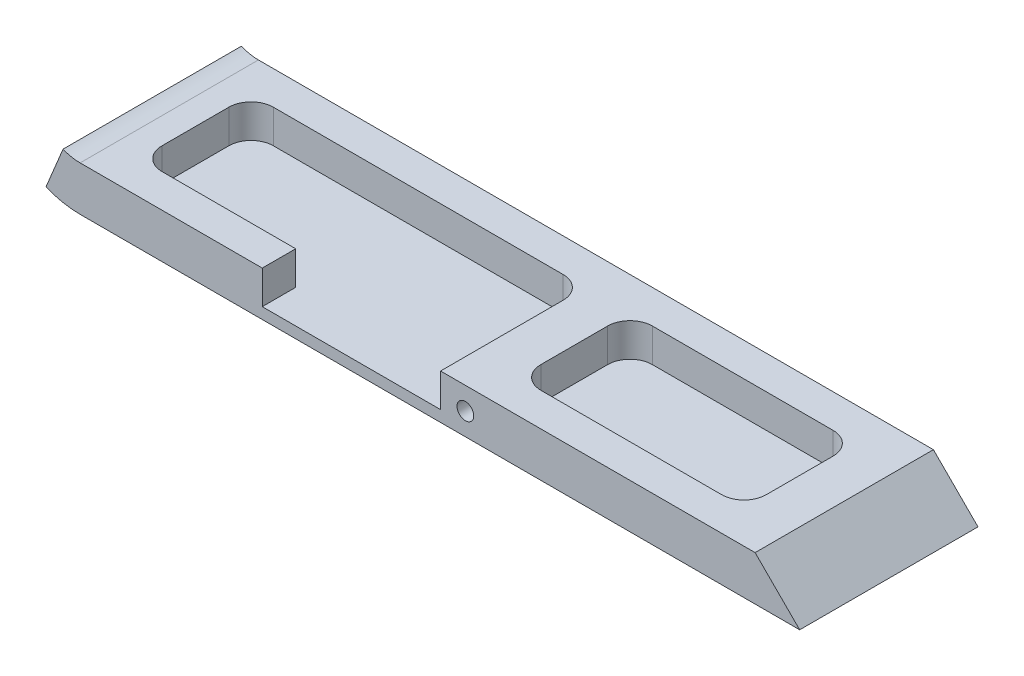
ISO-10303-21;
HEADER;
FILE_DESCRIPTION(('STEP AP214'),'2;1');
FILE_NAME('part.step','',(''),(''),'','','');
FILE_SCHEMA(('AUTOMOTIVE_DESIGN { 1 0 10303 214 1 1 1 1 }'));
ENDSEC;
DATA;
#1=APPLICATION_CONTEXT('core data for automotive mechanical design processes');
#2=APPLICATION_PROTOCOL_DEFINITION('international standard','automotive_design',2000,#1);
#3=PRODUCT_CONTEXT('',#1,'mechanical');
#4=PRODUCT('Part','Part','',(#3));
#5=PRODUCT_RELATED_PRODUCT_CATEGORY('part','',(#4));
#6=PRODUCT_DEFINITION_FORMATION('','',#4);
#7=PRODUCT_DEFINITION_CONTEXT('part definition',#1,'design');
#8=PRODUCT_DEFINITION('design','',#6,#7);
#9=PRODUCT_DEFINITION_SHAPE('','',#8);
#10=(LENGTH_UNIT() NAMED_UNIT(*) SI_UNIT(.MILLI.,.METRE.));
#11=(NAMED_UNIT(*) PLANE_ANGLE_UNIT() SI_UNIT($,.RADIAN.));
#12=(NAMED_UNIT(*) SI_UNIT($,.STERADIAN.) SOLID_ANGLE_UNIT());
#13=UNCERTAINTY_MEASURE_WITH_UNIT(LENGTH_MEASURE(1.E-05),#10,'distance_accuracy_value','');
#14=(GEOMETRIC_REPRESENTATION_CONTEXT(3) GLOBAL_UNCERTAINTY_ASSIGNED_CONTEXT((#13)) GLOBAL_UNIT_ASSIGNED_CONTEXT((#10,
#11,#12)) REPRESENTATION_CONTEXT('',''));
#15=CARTESIAN_POINT('',(0.,0.,0.));
#16=DIRECTION('',(0.,0.,1.));
#17=DIRECTION('',(1.,0.,0.));
#18=AXIS2_PLACEMENT_3D('',#15,#16,#17);
#19=CARTESIAN_POINT('',(202.8261468742,12.7,50.8));
#20=DIRECTION('',(0.,-1.,0.));
#21=DIRECTION('',(1.,0.,0.));
#22=AXIS2_PLACEMENT_3D('',#19,#20,#21);
#23=PLANE('',#22);
#24=DIRECTION('',(-1.,0.,0.));
#25=VECTOR('',#24,1.);
#26=CARTESIAN_POINT('',(132.260512242138,12.7,9.525));
#27=LINE('',#26,#25);
#28=CARTESIAN_POINT('',(183.7761468742,12.7,9.52499999999999));
#29=VERTEX_POINT('',#28);
#30=CARTESIAN_POINT('',(132.260512242138,12.7,9.525));
#31=VERTEX_POINT('',#30);
#32=EDGE_CURVE('E263',#29,#31,#27,.T.);
#33=ORIENTED_EDGE('',*,*,#32,.F.);
#34=CARTESIAN_POINT('',(183.7761468742,12.7,15.875));
#35=DIRECTION('',(0.,1.,0.));
#36=DIRECTION('',(1.,0.,0.));
#37=AXIS2_PLACEMENT_3D('',#34,#35,#36);
#38=CIRCLE('',#37,6.35);
#39=CARTESIAN_POINT('',(190.1261468742,12.7,15.875));
#40=VERTEX_POINT('',#39);
#41=EDGE_CURVE('E233',#40,#29,#38,.T.);
#42=ORIENTED_EDGE('',*,*,#41,.F.);
#43=DIRECTION('',(0.,0.,-1.));
#44=VECTOR('',#43,1.);
#45=CARTESIAN_POINT('',(190.1261468742,12.7,15.875));
#46=LINE('',#45,#44);
#47=CARTESIAN_POINT('',(190.1261468742,12.7,34.9249999999999));
#48=VERTEX_POINT('',#47);
#49=EDGE_CURVE('E240',#48,#40,#46,.T.);
#50=ORIENTED_EDGE('',*,*,#49,.F.);
#51=CARTESIAN_POINT('',(183.7761468742,12.7,34.925));
#52=DIRECTION('',(0.,1.,0.));
#53=DIRECTION('',(-1.,0.,0.));
#54=AXIS2_PLACEMENT_3D('',#51,#52,#53);
#55=CIRCLE('',#54,6.35);
#56=CARTESIAN_POINT('',(183.7761468742,12.7,41.275));
#57=VERTEX_POINT('',#56);
#58=EDGE_CURVE('E278',#57,#48,#55,.T.);
#59=ORIENTED_EDGE('',*,*,#58,.F.);
#60=DIRECTION('',(1.,0.,0.));
#61=VECTOR('',#60,1.);
#62=CARTESIAN_POINT('',(132.260512242138,12.7,41.275));
#63=LINE('',#62,#61);
#64=CARTESIAN_POINT('',(132.260512242138,12.7,41.275));
#65=VERTEX_POINT('',#64);
#66=EDGE_CURVE('E275',#65,#57,#63,.T.);
#67=ORIENTED_EDGE('',*,*,#66,.F.);
#68=CARTESIAN_POINT('',(132.260512242138,12.7,34.925));
#69=DIRECTION('',(0.,1.,0.));
#70=DIRECTION('',(-1.,0.,0.));
#71=AXIS2_PLACEMENT_3D('',#68,#69,#70);
#72=CIRCLE('',#71,6.35);
#73=CARTESIAN_POINT('',(125.910512242138,12.7,34.925));
#74=VERTEX_POINT('',#73);
#75=EDGE_CURVE('E272',#74,#65,#72,.T.);
#76=ORIENTED_EDGE('',*,*,#75,.F.);
#77=DIRECTION('',(0.,0.,1.));
#78=VECTOR('',#77,1.);
#79=CARTESIAN_POINT('',(125.910512242138,12.7,15.875));
#80=LINE('',#79,#78);
#81=CARTESIAN_POINT('',(125.910512242138,12.7,15.875));
#82=VERTEX_POINT('',#81);
#83=EDGE_CURVE('E269',#82,#74,#80,.T.);
#84=ORIENTED_EDGE('',*,*,#83,.F.);
#85=CARTESIAN_POINT('',(132.260512242138,12.7,15.875));
#86=DIRECTION('',(0.,1.,0.));
#87=DIRECTION('',(-1.,0.,0.));
#88=AXIS2_PLACEMENT_3D('',#85,#86,#87);
#89=CIRCLE('',#88,6.35);
#90=EDGE_CURVE('E266',#31,#82,#89,.T.);
#91=ORIENTED_EDGE('',*,*,#90,.F.);
#92=EDGE_LOOP('',(#33,#42,#50,#59,#67,#76,#84,#91));
#93=FACE_BOUND('',#92,.T.);
#94=DIRECTION('',(0.,0.,1.));
#95=VECTOR('',#94,1.);
#96=CARTESIAN_POINT('',(10.5210244842765,12.7,-5.34860316540539));
#97=LINE('',#96,#95);
#98=CARTESIAN_POINT('',(10.5210244842765,12.7,0.));
#99=VERTEX_POINT('',#98);
#100=CARTESIAN_POINT('',(10.5210244842765,12.7,50.8));
#101=VERTEX_POINT('',#100);
#102=EDGE_CURVE('E48',#99,#101,#97,.T.);
#103=ORIENTED_EDGE('',*,*,#102,.T.);
#104=DIRECTION('',(-1.,0.,0.));
#105=VECTOR('',#104,1.);
#106=CARTESIAN_POINT('',(202.8261468742,12.7,50.8));
#107=LINE('',#106,#105);
#108=CARTESIAN_POINT('',(62.4105122421382,12.7,50.8));
#109=VERTEX_POINT('',#108);
#110=EDGE_CURVE('E210',#109,#101,#107,.T.);
#111=ORIENTED_EDGE('',*,*,#110,.F.);
#112=DIRECTION('',(0.,0.,1.));
#113=VECTOR('',#112,1.);
#114=CARTESIAN_POINT('',(62.4105122421382,12.7,50.8));
#115=LINE('',#114,#113);
#116=CARTESIAN_POINT('',(62.4105122421382,12.7,41.275));
#117=VERTEX_POINT('',#116);
#118=EDGE_CURVE('E304',#117,#109,#115,.T.);
#119=ORIENTED_EDGE('',*,*,#118,.F.);
#120=DIRECTION('',(1.,0.,0.));
#121=VECTOR('',#120,1.);
#122=CARTESIAN_POINT('',(62.4105122421382,12.7,41.275));
#123=LINE('',#122,#121);
#124=CARTESIAN_POINT('',(24.3105122421383,12.7,41.275));
#125=VERTEX_POINT('',#124);
#126=EDGE_CURVE('E345',#125,#117,#123,.T.);
#127=ORIENTED_EDGE('',*,*,#126,.F.);
#128=CARTESIAN_POINT('',(24.3105122421383,12.7,34.925));
#129=DIRECTION('',(0.,1.,0.));
#130=DIRECTION('',(1.,0.,0.));
#131=AXIS2_PLACEMENT_3D('',#128,#129,#130);
#132=CIRCLE('',#131,6.35);
#133=CARTESIAN_POINT('',(17.9605122421383,12.7,34.925));
#134=VERTEX_POINT('',#133);
#135=EDGE_CURVE('E342',#134,#125,#132,.T.);
#136=ORIENTED_EDGE('',*,*,#135,.F.);
#137=DIRECTION('',(0.,0.,1.));
#138=VECTOR('',#137,1.);
#139=CARTESIAN_POINT('',(17.9605122421383,12.7,34.925));
#140=LINE('',#139,#138);
#141=CARTESIAN_POINT('',(17.9605122421383,12.7,15.875));
#142=VERTEX_POINT('',#141);
#143=EDGE_CURVE('E339',#142,#134,#140,.T.);
#144=ORIENTED_EDGE('',*,*,#143,.F.);
#145=CARTESIAN_POINT('',(24.3105122421383,12.7,15.875));
#146=DIRECTION('',(0.,1.,0.));
#147=DIRECTION('',(1.,0.,0.));
#148=AXIS2_PLACEMENT_3D('',#145,#146,#147);
#149=CIRCLE('',#148,6.35);
#150=CARTESIAN_POINT('',(24.3105122421383,12.7,9.525));
#151=VERTEX_POINT('',#150);
#152=EDGE_CURVE('E336',#151,#142,#149,.T.);
#153=ORIENTED_EDGE('',*,*,#152,.F.);
#154=DIRECTION('',(-1.,0.,0.));
#155=VECTOR('',#154,1.);
#156=CARTESIAN_POINT('',(106.860512242138,12.7,9.525));
#157=LINE('',#156,#155);
#158=CARTESIAN_POINT('',(106.860512242138,12.7,9.525));
#159=VERTEX_POINT('',#158);
#160=EDGE_CURVE('E333',#159,#151,#157,.T.);
#161=ORIENTED_EDGE('',*,*,#160,.F.);
#162=CARTESIAN_POINT('',(106.860512242138,12.7,15.875));
#163=DIRECTION('',(0.,1.,0.));
#164=DIRECTION('',(-1.,0.,0.));
#165=AXIS2_PLACEMENT_3D('',#162,#163,#164);
#166=CIRCLE('',#165,6.35);
#167=CARTESIAN_POINT('',(113.210512242138,12.7,15.875));
#168=VERTEX_POINT('',#167);
#169=EDGE_CURVE('E330',#168,#159,#166,.T.);
#170=ORIENTED_EDGE('',*,*,#169,.F.);
#171=DIRECTION('',(0.,0.,-1.));
#172=VECTOR('',#171,1.);
#173=CARTESIAN_POINT('',(113.210512242138,12.7,50.8));
#174=LINE('',#173,#172);
#175=CARTESIAN_POINT('',(113.210512242138,12.7,50.8));
#176=VERTEX_POINT('',#175);
#177=EDGE_CURVE('E285',#176,#168,#174,.T.);
#178=ORIENTED_EDGE('',*,*,#177,.F.);
#179=CARTESIAN_POINT('',(202.8261468742,12.7,50.8));
#180=VERTEX_POINT('',#179);
#181=EDGE_CURVE('E370',#180,#176,#107,.T.);
#182=ORIENTED_EDGE('',*,*,#181,.F.);
#183=DIRECTION('',(0.,0.,-1.));
#184=VECTOR('',#183,1.);
#185=CARTESIAN_POINT('',(202.8261468742,12.7,50.8));
#186=LINE('',#185,#184);
#187=CARTESIAN_POINT('',(202.8261468742,12.7,0.));
#188=VERTEX_POINT('',#187);
#189=EDGE_CURVE('E41',#180,#188,#186,.T.);
#190=ORIENTED_EDGE('',*,*,#189,.T.);
#191=DIRECTION('',(-1.,0.,0.));
#192=VECTOR('',#191,1.);
#193=CARTESIAN_POINT('',(202.8261468742,12.7,0.));
#194=LINE('',#193,#192);
#195=EDGE_CURVE('E53',#188,#99,#194,.T.);
#196=ORIENTED_EDGE('',*,*,#195,.T.);
#197=EDGE_LOOP('',(#103,#111,#119,#127,#136,#144,#153,#161,#170,#178,#182,#190,#196));
#198=FACE_BOUND('',#197,.T.);
#199=ADVANCED_FACE('F33',(#93,#198),#23,.F.);
#200=CARTESIAN_POINT('',(5.26051224213825,12.7,50.8));
#201=DIRECTION('',(0.923879532511288,-0.382683432365087,0.));
#202=DIRECTION('',(0.382683432365087,0.923879532511288,0.));
#203=AXIS2_PLACEMENT_3D('',#200,#201,#202);
#204=PLANE('',#203);
#205=DIRECTION('',(-0.382683432365087,-0.923879532511288,0.));
#206=VECTOR('',#205,1.);
#207=CARTESIAN_POINT('',(5.26051224213825,12.7,0.));
#208=LINE('',#207,#206);
#209=CARTESIAN_POINT('',(5.66094489323991,13.6667299371066,0.));
#210=VERTEX_POINT('',#209);
#211=CARTESIAN_POINT('',(0.800865302203315,1.93345987421329,0.));
#212=VERTEX_POINT('',#211);
#213=EDGE_CURVE('E351',#210,#212,#208,.T.);
#214=ORIENTED_EDGE('',*,*,#213,.T.);
#215=DIRECTION('',(0.,0.,1.));
#216=VECTOR('',#215,1.);
#217=CARTESIAN_POINT('',(0.800865302203313,1.93345987421329,0.));
#218=LINE('',#217,#216);
#219=CARTESIAN_POINT('',(0.800865302203313,1.93345987421329,50.8));
#220=VERTEX_POINT('',#219);
#221=EDGE_CURVE('E194',#212,#220,#218,.T.);
#222=ORIENTED_EDGE('',*,*,#221,.T.);
#223=DIRECTION('',(-0.382683432365087,-0.923879532511288,0.));
#224=VECTOR('',#223,1.);
#225=CARTESIAN_POINT('',(5.26051224213825,12.7,50.8));
#226=LINE('',#225,#224);
#227=CARTESIAN_POINT('',(5.66094489323991,13.6667299371066,50.8));
#228=VERTEX_POINT('',#227);
#229=EDGE_CURVE('E190',#228,#220,#226,.T.);
#230=ORIENTED_EDGE('',*,*,#229,.F.);
#231=DIRECTION('',(0.,0.,1.));
#232=VECTOR('',#231,1.);
#233=CARTESIAN_POINT('',(5.66094489323991,13.6667299371066,-5.34860316540539));
#234=LINE('',#233,#232);
#235=EDGE_CURVE('E193',#210,#228,#234,.T.);
#236=ORIENTED_EDGE('',*,*,#235,.F.);
#237=EDGE_LOOP('',(#214,#222,#230,#236));
#238=FACE_BOUND('',#237,.T.);
#239=ADVANCED_FACE('F35',(#238),#204,.F.);
#240=CARTESIAN_POINT('',(0.,0.,50.8));
#241=DIRECTION('',(0.,1.,0.));
#242=DIRECTION('',(0.,0.,1.));
#243=AXIS2_PLACEMENT_3D('',#240,#241,#242);
#244=PLANE('',#243);
#245=DIRECTION('',(1.,0.,0.));
#246=VECTOR('',#245,1.);
#247=CARTESIAN_POINT('',(0.,0.,50.8));
#248=LINE('',#247,#246);
#249=CARTESIAN_POINT('',(10.5210244842765,0.,50.8));
#250=VERTEX_POINT('',#249);
#251=CARTESIAN_POINT('',(215.5261468742,0.,50.8));
#252=VERTEX_POINT('',#251);
#253=EDGE_CURVE('E198',#250,#252,#248,.T.);
#254=ORIENTED_EDGE('',*,*,#253,.F.);
#255=DIRECTION('',(0.,0.,1.));
#256=VECTOR('',#255,1.);
#257=CARTESIAN_POINT('',(10.5210244842765,0.,0.));
#258=LINE('',#257,#256);
#259=CARTESIAN_POINT('',(10.5210244842765,0.,0.));
#260=VERTEX_POINT('',#259);
#261=EDGE_CURVE('E220',#260,#250,#258,.T.);
#262=ORIENTED_EDGE('',*,*,#261,.F.);
#263=DIRECTION('',(1.,0.,0.));
#264=VECTOR('',#263,1.);
#265=CARTESIAN_POINT('',(0.,0.,0.));
#266=LINE('',#265,#264);
#267=CARTESIAN_POINT('',(215.5261468742,0.,0.));
#268=VERTEX_POINT('',#267);
#269=EDGE_CURVE('E374',#260,#268,#266,.T.);
#270=ORIENTED_EDGE('',*,*,#269,.T.);
#271=DIRECTION('',(0.,0.,-1.));
#272=VECTOR('',#271,1.);
#273=CARTESIAN_POINT('',(215.5261468742,0.,50.8));
#274=LINE('',#273,#272);
#275=EDGE_CURVE('E11',#252,#268,#274,.T.);
#276=ORIENTED_EDGE('',*,*,#275,.F.);
#277=EDGE_LOOP('',(#254,#262,#270,#276));
#278=FACE_BOUND('',#277,.T.);
#279=ADVANCED_FACE('F392',(#278),#244,.F.);
#280=CARTESIAN_POINT('',(215.5261468742,0.,50.8));
#281=DIRECTION('',(-0.707106781186548,-0.707106781186546,0.));
#282=DIRECTION('',(0.707106781186547,-0.707106781186549,0.));
#283=AXIS2_PLACEMENT_3D('',#280,#281,#282);
#284=PLANE('',#283);
#285=DIRECTION('',(-0.707106781186546,0.707106781186549,0.));
#286=VECTOR('',#285,1.);
#287=CARTESIAN_POINT('',(215.5261468742,0.,0.));
#288=LINE('',#287,#286);
#289=EDGE_CURVE('E376',#268,#188,#288,.T.);
#290=ORIENTED_EDGE('',*,*,#289,.T.);
#291=ORIENTED_EDGE('',*,*,#189,.F.);
#292=DIRECTION('',(-0.707106781186546,0.707106781186549,0.));
#293=VECTOR('',#292,1.);
#294=CARTESIAN_POINT('',(215.5261468742,0.,50.8));
#295=LINE('',#294,#293);
#296=EDGE_CURVE('E368',#252,#180,#295,.T.);
#297=ORIENTED_EDGE('',*,*,#296,.F.);
#298=ORIENTED_EDGE('',*,*,#275,.T.);
#299=EDGE_LOOP('',(#290,#291,#297,#298));
#300=FACE_BOUND('',#299,.T.);
#301=ADVANCED_FACE('F395',(#300),#284,.F.);
#302=CARTESIAN_POINT('',(0.,0.,50.8));
#303=DIRECTION('',(0.,0.,1.));
#304=DIRECTION('',(1.,0.,0.));
#305=AXIS2_PLACEMENT_3D('',#302,#303,#304);
#306=PLANE('',#305);
#307=CARTESIAN_POINT('',(10.5210244842765,25.4,50.8));
#308=DIRECTION('',(0.,0.,-1.));
#309=DIRECTION('',(-1.,0.,0.));
#310=AXIS2_PLACEMENT_3D('',#307,#308,#309);
#311=CIRCLE('',#310,25.4);
#312=EDGE_CURVE('E218',#250,#220,#311,.T.);
#313=ORIENTED_EDGE('',*,*,#312,.F.);
#314=ORIENTED_EDGE('',*,*,#253,.T.);
#315=ORIENTED_EDGE('',*,*,#296,.T.);
#316=ORIENTED_EDGE('',*,*,#181,.T.);
#317=DIRECTION('',(0.,1.,0.));
#318=VECTOR('',#317,1.);
#319=CARTESIAN_POINT('',(113.210512242138,3.17499999999999,50.8));
#320=LINE('',#319,#318);
#321=CARTESIAN_POINT('',(113.210512242138,3.17499999999999,50.8));
#322=VERTEX_POINT('',#321);
#323=EDGE_CURVE('E349',#322,#176,#320,.T.);
#324=ORIENTED_EDGE('',*,*,#323,.F.);
#325=DIRECTION('',(1.,0.,0.));
#326=VECTOR('',#325,1.);
#327=CARTESIAN_POINT('',(113.210512242138,3.17499999999999,50.8));
#328=LINE('',#327,#326);
#329=CARTESIAN_POINT('',(62.4105122421382,3.17499999999998,50.8));
#330=VERTEX_POINT('',#329);
#331=EDGE_CURVE('E324',#330,#322,#328,.T.);
#332=ORIENTED_EDGE('',*,*,#331,.F.);
#333=DIRECTION('',(0.,1.,0.));
#334=VECTOR('',#333,1.);
#335=CARTESIAN_POINT('',(62.4105122421382,3.17499999999998,50.8));
#336=LINE('',#335,#334);
#337=EDGE_CURVE('E352',#330,#109,#336,.T.);
#338=ORIENTED_EDGE('',*,*,#337,.T.);
#339=ORIENTED_EDGE('',*,*,#110,.T.);
#340=CARTESIAN_POINT('',(10.5210244842765,25.4,50.8));
#341=DIRECTION('',(0.,0.,-1.));
#342=DIRECTION('',(-1.,0.,0.));
#343=AXIS2_PLACEMENT_3D('',#340,#341,#342);
#344=CIRCLE('',#343,12.7);
#345=EDGE_CURVE('E204',#101,#228,#344,.T.);
#346=ORIENTED_EDGE('',*,*,#345,.T.);
#347=ORIENTED_EDGE('',*,*,#229,.T.);
#348=EDGE_LOOP('',(#313,#314,#315,#316,#324,#332,#338,#339,#346,#347));
#349=FACE_BOUND('',#348,.T.);
#350=CARTESIAN_POINT('',(120.2761468742,6.35,50.8));
#351=DIRECTION('',(0.,0.,1.));
#352=DIRECTION('',(1.,0.,0.));
#353=AXIS2_PLACEMENT_3D('',#350,#351,#352);
#354=CIRCLE('',#353,2.38125000000001);
#355=CARTESIAN_POINT('',(122.6573968742,6.35,50.8));
#356=VERTEX_POINT('',#355);
#357=EDGE_CURVE('E222',#356,#356,#354,.T.);
#358=ORIENTED_EDGE('',*,*,#357,.F.);
#359=EDGE_LOOP('',(#358));
#360=FACE_BOUND('',#359,.T.);
#361=ADVANCED_FACE('F207',(#349,#360),#306,.T.);
#362=CARTESIAN_POINT('',(0.,0.,0.));
#363=DIRECTION('',(0.,0.,1.));
#364=DIRECTION('',(1.,0.,0.));
#365=AXIS2_PLACEMENT_3D('',#362,#363,#364);
#366=PLANE('',#365);
#367=CARTESIAN_POINT('',(120.2761468742,6.35,0.));
#368=DIRECTION('',(0.,0.,-1.));
#369=DIRECTION('',(-1.,0.,0.));
#370=AXIS2_PLACEMENT_3D('',#367,#368,#369);
#371=CIRCLE('',#370,2.38125000000001);
#372=CARTESIAN_POINT('',(117.8948968742,6.35,0.));
#373=VERTEX_POINT('',#372);
#374=EDGE_CURVE('E227',#373,#373,#371,.T.);
#375=ORIENTED_EDGE('',*,*,#374,.F.);
#376=EDGE_LOOP('',(#375));
#377=FACE_BOUND('',#376,.T.);
#378=ORIENTED_EDGE('',*,*,#269,.F.);
#379=CARTESIAN_POINT('',(10.5210244842765,25.4,0.));
#380=DIRECTION('',(0.,0.,-1.));
#381=DIRECTION('',(-1.,0.,0.));
#382=AXIS2_PLACEMENT_3D('',#379,#380,#381);
#383=CIRCLE('',#382,25.4);
#384=EDGE_CURVE('E215',#260,#212,#383,.T.);
#385=ORIENTED_EDGE('',*,*,#384,.T.);
#386=ORIENTED_EDGE('',*,*,#213,.F.);
#387=CARTESIAN_POINT('',(10.5210244842765,25.4,0.));
#388=DIRECTION('',(0.,0.,1.));
#389=DIRECTION('',(1.,0.,0.));
#390=AXIS2_PLACEMENT_3D('',#387,#388,#389);
#391=CIRCLE('',#390,12.7);
#392=EDGE_CURVE('E205',#210,#99,#391,.T.);
#393=ORIENTED_EDGE('',*,*,#392,.T.);
#394=ORIENTED_EDGE('',*,*,#195,.F.);
#395=ORIENTED_EDGE('',*,*,#289,.F.);
#396=EDGE_LOOP('',(#378,#385,#386,#393,#394,#395));
#397=FACE_BOUND('',#396,.T.);
#398=ADVANCED_FACE('F386',(#377,#397),#366,.F.);
#399=CARTESIAN_POINT('',(113.210512242138,3.17499999999999,50.8));
#400=DIRECTION('',(1.,0.,0.));
#401=DIRECTION('',(0.,1.,0.));
#402=AXIS2_PLACEMENT_3D('',#399,#400,#401);
#403=PLANE('',#402);
#404=ORIENTED_EDGE('',*,*,#177,.T.);
#405=DIRECTION('',(0.,1.,0.));
#406=VECTOR('',#405,1.);
#407=CARTESIAN_POINT('',(113.210512242138,3.17499999999999,15.875));
#408=LINE('',#407,#406);
#409=CARTESIAN_POINT('',(113.210512242138,3.17499999999999,15.875));
#410=VERTEX_POINT('',#409);
#411=EDGE_CURVE('E327',#410,#168,#408,.T.);
#412=ORIENTED_EDGE('',*,*,#411,.F.);
#413=DIRECTION('',(0.,0.,-1.));
#414=VECTOR('',#413,1.);
#415=CARTESIAN_POINT('',(113.210512242138,3.17499999999999,50.8));
#416=LINE('',#415,#414);
#417=EDGE_CURVE('E300',#322,#410,#416,.T.);
#418=ORIENTED_EDGE('',*,*,#417,.F.);
#419=ORIENTED_EDGE('',*,*,#323,.T.);
#420=EDGE_LOOP('',(#404,#412,#418,#419));
#421=FACE_BOUND('',#420,.T.);
#422=ADVANCED_FACE('F412',(#421),#403,.F.);
#423=CARTESIAN_POINT('',(62.4105122421382,3.17499999999998,50.8));
#424=DIRECTION('',(-1.,0.,0.));
#425=DIRECTION('',(0.,-1.,0.));
#426=AXIS2_PLACEMENT_3D('',#423,#424,#425);
#427=PLANE('',#426);
#428=ORIENTED_EDGE('',*,*,#118,.T.);
#429=ORIENTED_EDGE('',*,*,#337,.F.);
#430=DIRECTION('',(0.,0.,1.));
#431=VECTOR('',#430,1.);
#432=CARTESIAN_POINT('',(62.4105122421382,3.17499999999998,50.8));
#433=LINE('',#432,#431);
#434=CARTESIAN_POINT('',(62.4105122421382,3.17499999999998,41.275));
#435=VERTEX_POINT('',#434);
#436=EDGE_CURVE('E322',#435,#330,#433,.T.);
#437=ORIENTED_EDGE('',*,*,#436,.F.);
#438=DIRECTION('',(0.,1.,0.));
#439=VECTOR('',#438,1.);
#440=CARTESIAN_POINT('',(62.4105122421382,3.17499999999998,41.275));
#441=LINE('',#440,#439);
#442=EDGE_CURVE('E354',#435,#117,#441,.T.);
#443=ORIENTED_EDGE('',*,*,#442,.T.);
#444=EDGE_LOOP('',(#428,#429,#437,#443));
#445=FACE_BOUND('',#444,.T.);
#446=ADVANCED_FACE('F417',(#445),#427,.F.);
#447=CARTESIAN_POINT('',(62.4105122421382,3.17499999999998,41.275));
#448=DIRECTION('',(0.,0.,1.));
#449=DIRECTION('',(1.,0.,0.));
#450=AXIS2_PLACEMENT_3D('',#447,#448,#449);
#451=PLANE('',#450);
#452=ORIENTED_EDGE('',*,*,#126,.T.);
#453=ORIENTED_EDGE('',*,*,#442,.F.);
#454=DIRECTION('',(1.,0.,0.));
#455=VECTOR('',#454,1.);
#456=CARTESIAN_POINT('',(62.4105122421382,3.17499999999998,41.275));
#457=LINE('',#456,#455);
#458=CARTESIAN_POINT('',(24.3105122421383,3.17499999999998,41.275));
#459=VERTEX_POINT('',#458);
#460=EDGE_CURVE('E319',#459,#435,#457,.T.);
#461=ORIENTED_EDGE('',*,*,#460,.F.);
#462=DIRECTION('',(0.,1.,0.));
#463=VECTOR('',#462,1.);
#464=CARTESIAN_POINT('',(24.3105122421383,3.17499999999998,41.275));
#465=LINE('',#464,#463);
#466=EDGE_CURVE('E356',#459,#125,#465,.T.);
#467=ORIENTED_EDGE('',*,*,#466,.T.);
#468=EDGE_LOOP('',(#452,#453,#461,#467));
#469=FACE_BOUND('',#468,.T.);
#470=ADVANCED_FACE('F439',(#469),#451,.F.);
#471=CARTESIAN_POINT('',(24.3105122421383,3.17499999999998,34.925));
#472=DIRECTION('',(0.,1.,0.));
#473=DIRECTION('',(-1.,0.,0.));
#474=AXIS2_PLACEMENT_3D('',#471,#472,#473);
#475=CYLINDRICAL_SURFACE('',#474,6.35);
#476=ORIENTED_EDGE('',*,*,#135,.T.);
#477=ORIENTED_EDGE('',*,*,#466,.F.);
#478=CARTESIAN_POINT('',(24.3105122421383,3.17499999999998,34.925));
#479=DIRECTION('',(0.,1.,0.));
#480=DIRECTION('',(1.,0.,0.));
#481=AXIS2_PLACEMENT_3D('',#478,#479,#480);
#482=CIRCLE('',#481,6.35);
#483=CARTESIAN_POINT('',(17.9605122421383,3.17499999999998,34.925));
#484=VERTEX_POINT('',#483);
#485=EDGE_CURVE('E316',#484,#459,#482,.T.);
#486=ORIENTED_EDGE('',*,*,#485,.F.);
#487=DIRECTION('',(0.,1.,0.));
#488=VECTOR('',#487,1.);
#489=CARTESIAN_POINT('',(17.9605122421383,3.17499999999998,34.925));
#490=LINE('',#489,#488);
#491=EDGE_CURVE('E358',#484,#134,#490,.T.);
#492=ORIENTED_EDGE('',*,*,#491,.T.);
#493=EDGE_LOOP('',(#476,#477,#486,#492));
#494=FACE_BOUND('',#493,.T.);
#495=ADVANCED_FACE('F435',(#494),#475,.F.);
#496=CARTESIAN_POINT('',(17.9605122421383,3.17499999999998,34.925));
#497=DIRECTION('',(-1.,0.,0.));
#498=DIRECTION('',(0.,-1.,0.));
#499=AXIS2_PLACEMENT_3D('',#496,#497,#498);
#500=PLANE('',#499);
#501=ORIENTED_EDGE('',*,*,#143,.T.);
#502=ORIENTED_EDGE('',*,*,#491,.F.);
#503=DIRECTION('',(0.,0.,1.));
#504=VECTOR('',#503,1.);
#505=CARTESIAN_POINT('',(17.9605122421383,3.17499999999998,34.925));
#506=LINE('',#505,#504);
#507=CARTESIAN_POINT('',(17.9605122421383,3.17499999999998,15.875));
#508=VERTEX_POINT('',#507);
#509=EDGE_CURVE('E313',#508,#484,#506,.T.);
#510=ORIENTED_EDGE('',*,*,#509,.F.);
#511=DIRECTION('',(0.,1.,0.));
#512=VECTOR('',#511,1.);
#513=CARTESIAN_POINT('',(17.9605122421383,3.17499999999998,15.875));
#514=LINE('',#513,#512);
#515=EDGE_CURVE('E360',#508,#142,#514,.T.);
#516=ORIENTED_EDGE('',*,*,#515,.T.);
#517=EDGE_LOOP('',(#501,#502,#510,#516));
#518=FACE_BOUND('',#517,.T.);
#519=ADVANCED_FACE('F431',(#518),#500,.F.);
#520=CARTESIAN_POINT('',(24.3105122421383,3.17499999999998,15.875));
#521=DIRECTION('',(0.,1.,0.));
#522=DIRECTION('',(-1.,0.,0.));
#523=AXIS2_PLACEMENT_3D('',#520,#521,#522);
#524=CYLINDRICAL_SURFACE('',#523,6.35);
#525=ORIENTED_EDGE('',*,*,#152,.T.);
#526=ORIENTED_EDGE('',*,*,#515,.F.);
#527=CARTESIAN_POINT('',(24.3105122421383,3.17499999999998,15.875));
#528=DIRECTION('',(0.,1.,0.));
#529=DIRECTION('',(1.,0.,0.));
#530=AXIS2_PLACEMENT_3D('',#527,#528,#529);
#531=CIRCLE('',#530,6.35);
#532=CARTESIAN_POINT('',(24.3105122421383,3.17499999999998,9.525));
#533=VERTEX_POINT('',#532);
#534=EDGE_CURVE('E310',#533,#508,#531,.T.);
#535=ORIENTED_EDGE('',*,*,#534,.F.);
#536=DIRECTION('',(0.,1.,0.));
#537=VECTOR('',#536,1.);
#538=CARTESIAN_POINT('',(24.3105122421383,3.17499999999998,9.525));
#539=LINE('',#538,#537);
#540=EDGE_CURVE('E362',#533,#151,#539,.T.);
#541=ORIENTED_EDGE('',*,*,#540,.T.);
#542=EDGE_LOOP('',(#525,#526,#535,#541));
#543=FACE_BOUND('',#542,.T.);
#544=ADVANCED_FACE('F427',(#543),#524,.F.);
#545=CARTESIAN_POINT('',(106.860512242138,3.17499999999999,9.525));
#546=DIRECTION('',(0.,0.,-1.));
#547=DIRECTION('',(-1.,0.,0.));
#548=AXIS2_PLACEMENT_3D('',#545,#546,#547);
#549=PLANE('',#548);
#550=ORIENTED_EDGE('',*,*,#160,.T.);
#551=ORIENTED_EDGE('',*,*,#540,.F.);
#552=DIRECTION('',(-1.,0.,0.));
#553=VECTOR('',#552,1.);
#554=CARTESIAN_POINT('',(106.860512242138,3.17499999999999,9.525));
#555=LINE('',#554,#553);
#556=CARTESIAN_POINT('',(106.860512242138,3.17499999999999,9.525));
#557=VERTEX_POINT('',#556);
#558=EDGE_CURVE('E307',#557,#533,#555,.T.);
#559=ORIENTED_EDGE('',*,*,#558,.F.);
#560=DIRECTION('',(0.,1.,0.));
#561=VECTOR('',#560,1.);
#562=CARTESIAN_POINT('',(106.860512242138,3.17499999999999,9.525));
#563=LINE('',#562,#561);
#564=EDGE_CURVE('E364',#557,#159,#563,.T.);
#565=ORIENTED_EDGE('',*,*,#564,.T.);
#566=EDGE_LOOP('',(#550,#551,#559,#565));
#567=FACE_BOUND('',#566,.T.);
#568=ADVANCED_FACE('F423',(#567),#549,.F.);
#569=CARTESIAN_POINT('',(106.860512242138,3.17499999999999,15.875));
#570=DIRECTION('',(0.,1.,0.));
#571=DIRECTION('',(-1.,0.,0.));
#572=AXIS2_PLACEMENT_3D('',#569,#570,#571);
#573=CYLINDRICAL_SURFACE('',#572,6.35);
#574=ORIENTED_EDGE('',*,*,#169,.T.);
#575=ORIENTED_EDGE('',*,*,#564,.F.);
#576=CARTESIAN_POINT('',(106.860512242138,3.17499999999999,15.875));
#577=DIRECTION('',(0.,1.,0.));
#578=DIRECTION('',(-1.,0.,0.));
#579=AXIS2_PLACEMENT_3D('',#576,#577,#578);
#580=CIRCLE('',#579,6.35);
#581=EDGE_CURVE('E303',#410,#557,#580,.T.);
#582=ORIENTED_EDGE('',*,*,#581,.F.);
#583=ORIENTED_EDGE('',*,*,#411,.T.);
#584=EDGE_LOOP('',(#574,#575,#582,#583));
#585=FACE_BOUND('',#584,.T.);
#586=ADVANCED_FACE('F419',(#585),#573,.F.);
#587=CARTESIAN_POINT('',(106.860512242138,3.17499999999999,15.875));
#588=DIRECTION('',(0.,1.,0.));
#589=DIRECTION('',(-1.,0.,0.));
#590=AXIS2_PLACEMENT_3D('',#587,#588,#589);
#591=PLANE('',#590);
#592=ORIENTED_EDGE('',*,*,#417,.T.);
#593=ORIENTED_EDGE('',*,*,#581,.T.);
#594=ORIENTED_EDGE('',*,*,#558,.T.);
#595=ORIENTED_EDGE('',*,*,#534,.T.);
#596=ORIENTED_EDGE('',*,*,#509,.T.);
#597=ORIENTED_EDGE('',*,*,#485,.T.);
#598=ORIENTED_EDGE('',*,*,#460,.T.);
#599=ORIENTED_EDGE('',*,*,#436,.T.);
#600=ORIENTED_EDGE('',*,*,#331,.T.);
#601=EDGE_LOOP('',(#592,#593,#594,#595,#596,#597,#598,#599,#600));
#602=FACE_BOUND('',#601,.T.);
#603=ADVANCED_FACE('F422',(#602),#591,.T.);
#604=CARTESIAN_POINT('',(183.7761468742,3.175,15.875));
#605=DIRECTION('',(0.,1.,0.));
#606=DIRECTION('',(-1.,0.,0.));
#607=AXIS2_PLACEMENT_3D('',#604,#605,#606);
#608=CYLINDRICAL_SURFACE('',#607,6.35);
#609=ORIENTED_EDGE('',*,*,#41,.T.);
#610=DIRECTION('',(0.,1.,0.));
#611=VECTOR('',#610,1.);
#612=CARTESIAN_POINT('',(183.7761468742,3.175,9.52499999999999));
#613=LINE('',#612,#611);
#614=CARTESIAN_POINT('',(183.7761468742,3.175,9.52499999999999));
#615=VERTEX_POINT('',#614);
#616=EDGE_CURVE('E261',#615,#29,#613,.T.);
#617=ORIENTED_EDGE('',*,*,#616,.F.);
#618=CARTESIAN_POINT('',(183.7761468742,3.175,15.875));
#619=DIRECTION('',(0.,1.,0.));
#620=DIRECTION('',(1.,0.,0.));
#621=AXIS2_PLACEMENT_3D('',#618,#619,#620);
#622=CIRCLE('',#621,6.35);
#623=CARTESIAN_POINT('',(190.1261468742,3.175,15.875));
#624=VERTEX_POINT('',#623);
#625=EDGE_CURVE('E236',#624,#615,#622,.T.);
#626=ORIENTED_EDGE('',*,*,#625,.F.);
#627=DIRECTION('',(0.,1.,0.));
#628=VECTOR('',#627,1.);
#629=CARTESIAN_POINT('',(190.1261468742,3.175,15.875));
#630=LINE('',#629,#628);
#631=EDGE_CURVE('E283',#624,#40,#630,.T.);
#632=ORIENTED_EDGE('',*,*,#631,.T.);
#633=EDGE_LOOP('',(#609,#617,#626,#632));
#634=FACE_BOUND('',#633,.T.);
#635=ADVANCED_FACE('F449',(#634),#608,.F.);
#636=CARTESIAN_POINT('',(190.1261468742,3.175,15.875));
#637=DIRECTION('',(1.,0.,0.));
#638=DIRECTION('',(0.,1.,0.));
#639=AXIS2_PLACEMENT_3D('',#636,#637,#638);
#640=PLANE('',#639);
#641=ORIENTED_EDGE('',*,*,#49,.T.);
#642=ORIENTED_EDGE('',*,*,#631,.F.);
#643=DIRECTION('',(0.,0.,-1.));
#644=VECTOR('',#643,1.);
#645=CARTESIAN_POINT('',(190.1261468742,3.175,15.875));
#646=LINE('',#645,#644);
#647=CARTESIAN_POINT('',(190.1261468742,3.175,34.9249999999999));
#648=VERTEX_POINT('',#647);
#649=EDGE_CURVE('E258',#648,#624,#646,.T.);
#650=ORIENTED_EDGE('',*,*,#649,.F.);
#651=DIRECTION('',(0.,1.,0.));
#652=VECTOR('',#651,1.);
#653=CARTESIAN_POINT('',(190.1261468742,3.175,34.9249999999999));
#654=LINE('',#653,#652);
#655=EDGE_CURVE('E286',#648,#48,#654,.T.);
#656=ORIENTED_EDGE('',*,*,#655,.T.);
#657=EDGE_LOOP('',(#641,#642,#650,#656));
#658=FACE_BOUND('',#657,.T.);
#659=ADVANCED_FACE('F453',(#658),#640,.F.);
#660=CARTESIAN_POINT('',(183.7761468742,3.175,34.925));
#661=DIRECTION('',(0.,1.,0.));
#662=DIRECTION('',(-1.,0.,0.));
#663=AXIS2_PLACEMENT_3D('',#660,#661,#662);
#664=CYLINDRICAL_SURFACE('',#663,6.35);
#665=ORIENTED_EDGE('',*,*,#58,.T.);
#666=ORIENTED_EDGE('',*,*,#655,.F.);
#667=CARTESIAN_POINT('',(183.7761468742,3.175,34.925));
#668=DIRECTION('',(0.,1.,0.));
#669=DIRECTION('',(-1.,0.,0.));
#670=AXIS2_PLACEMENT_3D('',#667,#668,#669);
#671=CIRCLE('',#670,6.35);
#672=CARTESIAN_POINT('',(183.7761468742,3.175,41.275));
#673=VERTEX_POINT('',#672);
#674=EDGE_CURVE('E255',#673,#648,#671,.T.);
#675=ORIENTED_EDGE('',*,*,#674,.F.);
#676=DIRECTION('',(0.,1.,0.));
#677=VECTOR('',#676,1.);
#678=CARTESIAN_POINT('',(183.7761468742,3.175,41.275));
#679=LINE('',#678,#677);
#680=EDGE_CURVE('E288',#673,#57,#679,.T.);
#681=ORIENTED_EDGE('',*,*,#680,.T.);
#682=EDGE_LOOP('',(#665,#666,#675,#681));
#683=FACE_BOUND('',#682,.T.);
#684=ADVANCED_FACE('F475',(#683),#664,.F.);
#685=CARTESIAN_POINT('',(132.260512242138,3.17499999999999,41.275));
#686=DIRECTION('',(0.,0.,1.));
#687=DIRECTION('',(1.,0.,0.));
#688=AXIS2_PLACEMENT_3D('',#685,#686,#687);
#689=PLANE('',#688);
#690=ORIENTED_EDGE('',*,*,#66,.T.);
#691=ORIENTED_EDGE('',*,*,#680,.F.);
#692=DIRECTION('',(1.,0.,0.));
#693=VECTOR('',#692,1.);
#694=CARTESIAN_POINT('',(132.260512242138,3.17499999999999,41.275));
#695=LINE('',#694,#693);
#696=CARTESIAN_POINT('',(132.260512242138,3.17499999999999,41.275));
#697=VERTEX_POINT('',#696);
#698=EDGE_CURVE('E252',#697,#673,#695,.T.);
#699=ORIENTED_EDGE('',*,*,#698,.F.);
#700=DIRECTION('',(0.,1.,0.));
#701=VECTOR('',#700,1.);
#702=CARTESIAN_POINT('',(132.260512242138,3.17499999999999,41.275));
#703=LINE('',#702,#701);
#704=EDGE_CURVE('E290',#697,#65,#703,.T.);
#705=ORIENTED_EDGE('',*,*,#704,.T.);
#706=EDGE_LOOP('',(#690,#691,#699,#705));
#707=FACE_BOUND('',#706,.T.);
#708=ADVANCED_FACE('F471',(#707),#689,.F.);
#709=CARTESIAN_POINT('',(132.260512242138,3.17499999999999,34.925));
#710=DIRECTION('',(0.,1.,0.));
#711=DIRECTION('',(-1.,0.,0.));
#712=AXIS2_PLACEMENT_3D('',#709,#710,#711);
#713=CYLINDRICAL_SURFACE('',#712,6.35);
#714=ORIENTED_EDGE('',*,*,#75,.T.);
#715=ORIENTED_EDGE('',*,*,#704,.F.);
#716=CARTESIAN_POINT('',(132.260512242138,3.17499999999999,34.925));
#717=DIRECTION('',(0.,1.,0.));
#718=DIRECTION('',(-1.,0.,0.));
#719=AXIS2_PLACEMENT_3D('',#716,#717,#718);
#720=CIRCLE('',#719,6.35);
#721=CARTESIAN_POINT('',(125.910512242138,3.17499999999999,34.925));
#722=VERTEX_POINT('',#721);
#723=EDGE_CURVE('E249',#722,#697,#720,.T.);
#724=ORIENTED_EDGE('',*,*,#723,.F.);
#725=DIRECTION('',(0.,1.,0.));
#726=VECTOR('',#725,1.);
#727=CARTESIAN_POINT('',(125.910512242138,3.17499999999999,34.925));
#728=LINE('',#727,#726);
#729=EDGE_CURVE('E292',#722,#74,#728,.T.);
#730=ORIENTED_EDGE('',*,*,#729,.T.);
#731=EDGE_LOOP('',(#714,#715,#724,#730));
#732=FACE_BOUND('',#731,.T.);
#733=ADVANCED_FACE('F467',(#732),#713,.F.);
#734=CARTESIAN_POINT('',(125.910512242138,3.17499999999999,15.875));
#735=DIRECTION('',(-1.,0.,0.));
#736=DIRECTION('',(0.,-1.,0.));
#737=AXIS2_PLACEMENT_3D('',#734,#735,#736);
#738=PLANE('',#737);
#739=ORIENTED_EDGE('',*,*,#83,.T.);
#740=ORIENTED_EDGE('',*,*,#729,.F.);
#741=DIRECTION('',(0.,0.,1.));
#742=VECTOR('',#741,1.);
#743=CARTESIAN_POINT('',(125.910512242138,3.17499999999999,15.875));
#744=LINE('',#743,#742);
#745=CARTESIAN_POINT('',(125.910512242138,3.17499999999999,15.875));
#746=VERTEX_POINT('',#745);
#747=EDGE_CURVE('E246',#746,#722,#744,.T.);
#748=ORIENTED_EDGE('',*,*,#747,.F.);
#749=DIRECTION('',(0.,1.,0.));
#750=VECTOR('',#749,1.);
#751=CARTESIAN_POINT('',(125.910512242138,3.17499999999999,15.875));
#752=LINE('',#751,#750);
#753=EDGE_CURVE('E294',#746,#82,#752,.T.);
#754=ORIENTED_EDGE('',*,*,#753,.T.);
#755=EDGE_LOOP('',(#739,#740,#748,#754));
#756=FACE_BOUND('',#755,.T.);
#757=ADVANCED_FACE('F463',(#756),#738,.F.);
#758=CARTESIAN_POINT('',(132.260512242138,3.17499999999999,15.875));
#759=DIRECTION('',(0.,1.,0.));
#760=DIRECTION('',(-1.,0.,0.));
#761=AXIS2_PLACEMENT_3D('',#758,#759,#760);
#762=CYLINDRICAL_SURFACE('',#761,6.35);
#763=ORIENTED_EDGE('',*,*,#90,.T.);
#764=ORIENTED_EDGE('',*,*,#753,.F.);
#765=CARTESIAN_POINT('',(132.260512242138,3.17499999999999,15.875));
#766=DIRECTION('',(0.,1.,0.));
#767=DIRECTION('',(-1.,0.,0.));
#768=AXIS2_PLACEMENT_3D('',#765,#766,#767);
#769=CIRCLE('',#768,6.35);
#770=CARTESIAN_POINT('',(132.260512242138,3.17499999999999,9.525));
#771=VERTEX_POINT('',#770);
#772=EDGE_CURVE('E243',#771,#746,#769,.T.);
#773=ORIENTED_EDGE('',*,*,#772,.F.);
#774=DIRECTION('',(0.,1.,0.));
#775=VECTOR('',#774,1.);
#776=CARTESIAN_POINT('',(132.260512242138,3.17499999999999,9.525));
#777=LINE('',#776,#775);
#778=EDGE_CURVE('E296',#771,#31,#777,.T.);
#779=ORIENTED_EDGE('',*,*,#778,.T.);
#780=EDGE_LOOP('',(#763,#764,#773,#779));
#781=FACE_BOUND('',#780,.T.);
#782=ADVANCED_FACE('F459',(#781),#762,.F.);
#783=CARTESIAN_POINT('',(132.260512242138,3.17499999999999,9.525));
#784=DIRECTION('',(0.,0.,-1.));
#785=DIRECTION('',(-1.,0.,0.));
#786=AXIS2_PLACEMENT_3D('',#783,#784,#785);
#787=PLANE('',#786);
#788=ORIENTED_EDGE('',*,*,#32,.T.);
#789=ORIENTED_EDGE('',*,*,#778,.F.);
#790=DIRECTION('',(-1.,0.,0.));
#791=VECTOR('',#790,1.);
#792=CARTESIAN_POINT('',(132.260512242138,3.17499999999999,9.525));
#793=LINE('',#792,#791);
#794=EDGE_CURVE('E239',#615,#771,#793,.T.);
#795=ORIENTED_EDGE('',*,*,#794,.F.);
#796=ORIENTED_EDGE('',*,*,#616,.T.);
#797=EDGE_LOOP('',(#788,#789,#795,#796));
#798=FACE_BOUND('',#797,.T.);
#799=ADVANCED_FACE('F455',(#798),#787,.F.);
#800=CARTESIAN_POINT('',(183.7761468742,3.175,15.875));
#801=DIRECTION('',(0.,-1.,0.));
#802=DIRECTION('',(1.,0.,0.));
#803=AXIS2_PLACEMENT_3D('',#800,#801,#802);
#804=PLANE('',#803);
#805=ORIENTED_EDGE('',*,*,#625,.T.);
#806=ORIENTED_EDGE('',*,*,#794,.T.);
#807=ORIENTED_EDGE('',*,*,#772,.T.);
#808=ORIENTED_EDGE('',*,*,#747,.T.);
#809=ORIENTED_EDGE('',*,*,#723,.T.);
#810=ORIENTED_EDGE('',*,*,#698,.T.);
#811=ORIENTED_EDGE('',*,*,#674,.T.);
#812=ORIENTED_EDGE('',*,*,#649,.T.);
#813=EDGE_LOOP('',(#805,#806,#807,#808,#809,#810,#811,#812));
#814=FACE_BOUND('',#813,.T.);
#815=ADVANCED_FACE('F458',(#814),#804,.F.);
#816=CARTESIAN_POINT('',(120.2761468742,6.35,15.875));
#817=DIRECTION('',(0.,0.,-1.));
#818=DIRECTION('',(-1.,0.,0.));
#819=AXIS2_PLACEMENT_3D('',#816,#817,#818);
#820=CYLINDRICAL_SURFACE('',#819,2.38125000000001);
#821=CARTESIAN_POINT('',(120.2761468742,6.35,15.875));
#822=DIRECTION('',(0.,0.,-1.));
#823=DIRECTION('',(-1.,0.,0.));
#824=AXIS2_PLACEMENT_3D('',#821,#822,#823);
#825=CIRCLE('',#824,2.38125000000001);
#826=CARTESIAN_POINT('',(117.8948968742,6.35,15.875));
#827=VERTEX_POINT('',#826);
#828=EDGE_CURVE('E230',#827,#827,#825,.T.);
#829=ORIENTED_EDGE('',*,*,#828,.F.);
#830=EDGE_LOOP('',(#829));
#831=FACE_BOUND('',#830,.T.);
#832=ORIENTED_EDGE('',*,*,#374,.T.);
#833=EDGE_LOOP('',(#832));
#834=FACE_BOUND('',#833,.T.);
#835=ADVANCED_FACE('F485',(#831,#834),#820,.F.);
#836=CARTESIAN_POINT('',(120.2761468742,6.35,15.875));
#837=DIRECTION('',(0.,0.,-1.));
#838=DIRECTION('',(-1.,0.,0.));
#839=AXIS2_PLACEMENT_3D('',#836,#837,#838);
#840=PLANE('',#839);
#841=ORIENTED_EDGE('',*,*,#828,.T.);
#842=EDGE_LOOP('',(#841));
#843=FACE_BOUND('',#842,.T.);
#844=ADVANCED_FACE('F489',(#843),#840,.T.);
#845=CARTESIAN_POINT('',(120.2761468742,6.35,34.925));
#846=DIRECTION('',(0.,0.,1.));
#847=DIRECTION('',(1.,0.,0.));
#848=AXIS2_PLACEMENT_3D('',#845,#846,#847);
#849=CYLINDRICAL_SURFACE('',#848,2.38125000000001);
#850=CARTESIAN_POINT('',(120.2761468742,6.35,34.925));
#851=DIRECTION('',(0.,0.,1.));
#852=DIRECTION('',(1.,0.,0.));
#853=AXIS2_PLACEMENT_3D('',#850,#851,#852);
#854=CIRCLE('',#853,2.38125000000001);
#855=CARTESIAN_POINT('',(122.6573968742,6.35,34.925));
#856=VERTEX_POINT('',#855);
#857=EDGE_CURVE('E224',#856,#856,#854,.T.);
#858=ORIENTED_EDGE('',*,*,#857,.F.);
#859=EDGE_LOOP('',(#858));
#860=FACE_BOUND('',#859,.T.);
#861=ORIENTED_EDGE('',*,*,#357,.T.);
#862=EDGE_LOOP('',(#861));
#863=FACE_BOUND('',#862,.T.);
#864=ADVANCED_FACE('F493',(#860,#863),#849,.F.);
#865=CARTESIAN_POINT('',(120.2761468742,6.35,34.925));
#866=DIRECTION('',(0.,0.,1.));
#867=DIRECTION('',(1.,0.,0.));
#868=AXIS2_PLACEMENT_3D('',#865,#866,#867);
#869=PLANE('',#868);
#870=ORIENTED_EDGE('',*,*,#857,.T.);
#871=EDGE_LOOP('',(#870));
#872=FACE_BOUND('',#871,.T.);
#873=ADVANCED_FACE('F497',(#872),#869,.T.);
#874=CARTESIAN_POINT('',(10.5210244842765,25.4,0.));
#875=DIRECTION('',(0.,0.,1.));
#876=DIRECTION('',(1.,0.,0.));
#877=AXIS2_PLACEMENT_3D('',#874,#875,#876);
#878=CYLINDRICAL_SURFACE('',#877,25.4);
#879=ORIENTED_EDGE('',*,*,#312,.T.);
#880=ORIENTED_EDGE('',*,*,#221,.F.);
#881=ORIENTED_EDGE('',*,*,#384,.F.);
#882=ORIENTED_EDGE('',*,*,#261,.T.);
#883=EDGE_LOOP('',(#879,#880,#881,#882));
#884=FACE_BOUND('',#883,.T.);
#885=ADVANCED_FACE('F389',(#884),#878,.T.);
#886=CARTESIAN_POINT('',(10.5210244842765,25.4,-5.34860316540539));
#887=DIRECTION('',(0.,0.,1.));
#888=DIRECTION('',(1.,0.,0.));
#889=AXIS2_PLACEMENT_3D('',#886,#887,#888);
#890=CYLINDRICAL_SURFACE('',#889,12.7);
#891=ORIENTED_EDGE('',*,*,#392,.F.);
#892=ORIENTED_EDGE('',*,*,#235,.T.);
#893=ORIENTED_EDGE('',*,*,#345,.F.);
#894=ORIENTED_EDGE('',*,*,#102,.F.);
#895=EDGE_LOOP('',(#891,#892,#893,#894));
#896=FACE_BOUND('',#895,.T.);
#897=ADVANCED_FACE('F203',(#896),#890,.F.);
#898=CLOSED_SHELL('',(#199,#239,#279,#301,#361,#398,#422,#446,#470,#495,#519,#544,#568,#586,
#603,#635,#659,#684,#708,#733,#757,#782,#799,#815,#835,#844,#864,#873,#885,#897));
#899=MANIFOLD_SOLID_BREP('B2',#898);
#900=ADVANCED_BREP_SHAPE_REPRESENTATION('',(#18,#899),#14);
#901=SHAPE_DEFINITION_REPRESENTATION(#9,#900);
ENDSEC;
END-ISO-10303-21;
